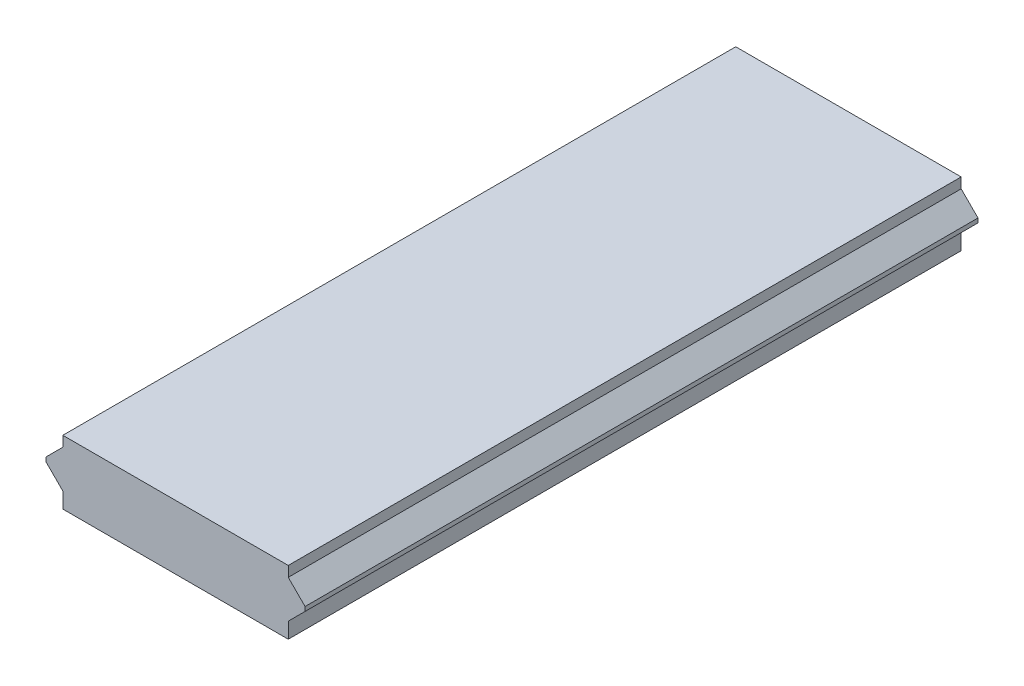
ISO-10303-21;
HEADER;
FILE_DESCRIPTION(('STEP AP214'),'2;1');
FILE_NAME('part.step','',(''),(''),'','','');
FILE_SCHEMA(('AUTOMOTIVE_DESIGN { 1 0 10303 214 1 1 1 1 }'));
ENDSEC;
DATA;
#1=APPLICATION_CONTEXT('core data for automotive mechanical design processes');
#2=APPLICATION_PROTOCOL_DEFINITION('international standard','automotive_design',2000,#1);
#3=PRODUCT_CONTEXT('',#1,'mechanical');
#4=PRODUCT('Part','Part','',(#3));
#5=PRODUCT_RELATED_PRODUCT_CATEGORY('part','',(#4));
#6=PRODUCT_DEFINITION_FORMATION('','',#4);
#7=PRODUCT_DEFINITION_CONTEXT('part definition',#1,'design');
#8=PRODUCT_DEFINITION('design','',#6,#7);
#9=PRODUCT_DEFINITION_SHAPE('','',#8);
#10=(LENGTH_UNIT() NAMED_UNIT(*) SI_UNIT(.MILLI.,.METRE.));
#11=(NAMED_UNIT(*) PLANE_ANGLE_UNIT() SI_UNIT($,.RADIAN.));
#12=(NAMED_UNIT(*) SI_UNIT($,.STERADIAN.) SOLID_ANGLE_UNIT());
#13=UNCERTAINTY_MEASURE_WITH_UNIT(LENGTH_MEASURE(1.E-05),#10,'distance_accuracy_value','');
#14=(GEOMETRIC_REPRESENTATION_CONTEXT(3) GLOBAL_UNCERTAINTY_ASSIGNED_CONTEXT((#13)) GLOBAL_UNIT_ASSIGNED_CONTEXT((#10,
#11,#12)) REPRESENTATION_CONTEXT('',''));
#15=CARTESIAN_POINT('',(0.,0.,0.));
#16=DIRECTION('',(0.,0.,1.));
#17=DIRECTION('',(1.,0.,0.));
#18=AXIS2_PLACEMENT_3D('',#15,#16,#17);
#19=CARTESIAN_POINT('',(-73.,30.7790066638099,-200.));
#20=DIRECTION('',(-1.,0.,0.));
#21=DIRECTION('',(0.,0.,1.));
#22=AXIS2_PLACEMENT_3D('',#19,#20,#21);
#23=PLANE('',#22);
#24=DIRECTION('',(0.,-1.,0.));
#25=VECTOR('',#24,1.);
#26=CARTESIAN_POINT('',(-73.,30.7790066638099,0.));
#27=LINE('',#26,#25);
#28=CARTESIAN_POINT('',(-73.,35.4358609133023,0.));
#29=VERTEX_POINT('',#28);
#30=CARTESIAN_POINT('',(-73.,30.7790066638099,0.));
#31=VERTEX_POINT('',#30);
#32=EDGE_CURVE('E156',#29,#31,#27,.T.);
#33=ORIENTED_EDGE('',*,*,#32,.F.);
#34=DIRECTION('',(0.,0.,1.));
#35=VECTOR('',#34,1.);
#36=CARTESIAN_POINT('',(-73.,35.4358609133023,-200.));
#37=LINE('',#36,#35);
#38=CARTESIAN_POINT('',(-73.,35.4358609133023,-200.));
#39=VERTEX_POINT('',#38);
#40=EDGE_CURVE('E11',#39,#29,#37,.T.);
#41=ORIENTED_EDGE('',*,*,#40,.F.);
#42=DIRECTION('',(0.,-1.,0.));
#43=VECTOR('',#42,1.);
#44=CARTESIAN_POINT('',(-73.,30.7790066638099,-200.));
#45=LINE('',#44,#43);
#46=CARTESIAN_POINT('',(-73.,30.7790066638099,-200.));
#47=VERTEX_POINT('',#46);
#48=EDGE_CURVE('E188',#39,#47,#45,.T.);
#49=ORIENTED_EDGE('',*,*,#48,.T.);
#50=DIRECTION('',(0.,0.,1.));
#51=VECTOR('',#50,1.);
#52=CARTESIAN_POINT('',(-73.,30.7790066638099,-200.));
#53=LINE('',#52,#51);
#54=EDGE_CURVE('E38',#47,#31,#53,.T.);
#55=ORIENTED_EDGE('',*,*,#54,.T.);
#56=EDGE_LOOP('',(#33,#41,#49,#55));
#57=FACE_BOUND('',#56,.T.);
#58=ADVANCED_FACE('F35',(#57),#23,.T.);
#59=CARTESIAN_POINT('',(-73.,35.4358609133023,-200.));
#60=DIRECTION('',(-0.707106781186547,-0.707106781186547,0.));
#61=DIRECTION('',(0.707106781186548,-0.707106781186548,0.));
#62=AXIS2_PLACEMENT_3D('',#59,#60,#61);
#63=PLANE('',#62);
#64=DIRECTION('',(0.707106781186547,-0.707106781186547,0.));
#65=VECTOR('',#64,1.);
#66=CARTESIAN_POINT('',(-73.,35.4358609133023,0.));
#67=LINE('',#66,#65);
#68=CARTESIAN_POINT('',(-78.,40.4358609133023,0.));
#69=VERTEX_POINT('',#68);
#70=EDGE_CURVE('E186',#69,#29,#67,.T.);
#71=ORIENTED_EDGE('',*,*,#70,.F.);
#72=DIRECTION('',(0.,0.,1.));
#73=VECTOR('',#72,1.);
#74=CARTESIAN_POINT('',(-78.,40.4358609133023,-200.));
#75=LINE('',#74,#73);
#76=CARTESIAN_POINT('',(-78.,40.4358609133023,-200.));
#77=VERTEX_POINT('',#76);
#78=EDGE_CURVE('E44',#77,#69,#75,.T.);
#79=ORIENTED_EDGE('',*,*,#78,.F.);
#80=DIRECTION('',(0.707106781186547,-0.707106781186547,0.));
#81=VECTOR('',#80,1.);
#82=CARTESIAN_POINT('',(-73.,35.4358609133023,-200.));
#83=LINE('',#82,#81);
#84=EDGE_CURVE('E146',#77,#39,#83,.T.);
#85=ORIENTED_EDGE('',*,*,#84,.T.);
#86=ORIENTED_EDGE('',*,*,#40,.T.);
#87=EDGE_LOOP('',(#71,#79,#85,#86));
#88=FACE_BOUND('',#87,.T.);
#89=ADVANCED_FACE('F208',(#88),#63,.T.);
#90=CARTESIAN_POINT('',(-78.,40.4358609133023,-200.));
#91=DIRECTION('',(-1.,0.,0.));
#92=DIRECTION('',(0.,0.,1.));
#93=AXIS2_PLACEMENT_3D('',#90,#91,#92);
#94=PLANE('',#93);
#95=DIRECTION('',(0.,-1.,0.));
#96=VECTOR('',#95,1.);
#97=CARTESIAN_POINT('',(-78.,40.4358609133023,0.));
#98=LINE('',#97,#96);
#99=CARTESIAN_POINT('',(-78.,41.7079388519444,0.));
#100=VERTEX_POINT('',#99);
#101=EDGE_CURVE('E133',#100,#69,#98,.T.);
#102=ORIENTED_EDGE('',*,*,#101,.F.);
#103=DIRECTION('',(0.,0.,1.));
#104=VECTOR('',#103,1.);
#105=CARTESIAN_POINT('',(-78.,41.7079388519444,-200.));
#106=LINE('',#105,#104);
#107=CARTESIAN_POINT('',(-78.,41.7079388519444,-200.));
#108=VERTEX_POINT('',#107);
#109=EDGE_CURVE('E128',#108,#100,#106,.T.);
#110=ORIENTED_EDGE('',*,*,#109,.F.);
#111=DIRECTION('',(0.,-1.,0.));
#112=VECTOR('',#111,1.);
#113=CARTESIAN_POINT('',(-78.,40.4358609133023,-200.));
#114=LINE('',#113,#112);
#115=EDGE_CURVE('E131',#108,#77,#114,.T.);
#116=ORIENTED_EDGE('',*,*,#115,.T.);
#117=ORIENTED_EDGE('',*,*,#78,.T.);
#118=EDGE_LOOP('',(#102,#110,#116,#117));
#119=FACE_BOUND('',#118,.T.);
#120=ADVANCED_FACE('F130',(#119),#94,.T.);
#121=CARTESIAN_POINT('',(-78.,41.7079388519444,-200.));
#122=DIRECTION('',(-0.707106781186548,0.707106781186547,0.));
#123=DIRECTION('',(-0.707106781186547,-0.707106781186548,0.));
#124=AXIS2_PLACEMENT_3D('',#121,#122,#123);
#125=PLANE('',#124);
#126=DIRECTION('',(-0.707106781186547,-0.707106781186548,0.));
#127=VECTOR('',#126,1.);
#128=CARTESIAN_POINT('',(-78.,41.7079388519444,0.));
#129=LINE('',#128,#127);
#130=CARTESIAN_POINT('',(-73.,46.7079388519444,0.));
#131=VERTEX_POINT('',#130);
#132=EDGE_CURVE('E183',#131,#100,#129,.T.);
#133=ORIENTED_EDGE('',*,*,#132,.F.);
#134=DIRECTION('',(0.,0.,1.));
#135=VECTOR('',#134,1.);
#136=CARTESIAN_POINT('',(-73.,46.7079388519444,-200.));
#137=LINE('',#136,#135);
#138=CARTESIAN_POINT('',(-73.,46.7079388519444,-200.));
#139=VERTEX_POINT('',#138);
#140=EDGE_CURVE('E138',#139,#131,#137,.T.);
#141=ORIENTED_EDGE('',*,*,#140,.F.);
#142=DIRECTION('',(-0.707106781186547,-0.707106781186548,0.));
#143=VECTOR('',#142,1.);
#144=CARTESIAN_POINT('',(-78.,41.7079388519444,-200.));
#145=LINE('',#144,#143);
#146=EDGE_CURVE('E144',#139,#108,#145,.T.);
#147=ORIENTED_EDGE('',*,*,#146,.T.);
#148=ORIENTED_EDGE('',*,*,#109,.T.);
#149=EDGE_LOOP('',(#133,#141,#147,#148));
#150=FACE_BOUND('',#149,.T.);
#151=ADVANCED_FACE('F148',(#150),#125,.T.);
#152=CARTESIAN_POINT('',(-73.,46.7079388519444,-200.));
#153=DIRECTION('',(-1.,0.,0.));
#154=DIRECTION('',(0.,0.,1.));
#155=AXIS2_PLACEMENT_3D('',#152,#153,#154);
#156=PLANE('',#155);
#157=DIRECTION('',(0.,-1.,0.));
#158=VECTOR('',#157,1.);
#159=CARTESIAN_POINT('',(-73.,46.7079388519444,0.));
#160=LINE('',#159,#158);
#161=CARTESIAN_POINT('',(-73.,49.7790066638099,0.));
#162=VERTEX_POINT('',#161);
#163=EDGE_CURVE('E180',#162,#131,#160,.T.);
#164=ORIENTED_EDGE('',*,*,#163,.F.);
#165=DIRECTION('',(0.,0.,1.));
#166=VECTOR('',#165,1.);
#167=CARTESIAN_POINT('',(-73.,49.7790066638099,-200.));
#168=LINE('',#167,#166);
#169=CARTESIAN_POINT('',(-73.,49.7790066638099,-200.));
#170=VERTEX_POINT('',#169);
#171=EDGE_CURVE('E192',#170,#162,#168,.T.);
#172=ORIENTED_EDGE('',*,*,#171,.F.);
#173=DIRECTION('',(0.,-1.,0.));
#174=VECTOR('',#173,1.);
#175=CARTESIAN_POINT('',(-73.,46.7079388519444,-200.));
#176=LINE('',#175,#174);
#177=EDGE_CURVE('E149',#170,#139,#176,.T.);
#178=ORIENTED_EDGE('',*,*,#177,.T.);
#179=ORIENTED_EDGE('',*,*,#140,.T.);
#180=EDGE_LOOP('',(#164,#172,#178,#179));
#181=FACE_BOUND('',#180,.T.);
#182=ADVANCED_FACE('F221',(#181),#156,.T.);
#183=CARTESIAN_POINT('',(-73.,49.7790066638099,-200.));
#184=DIRECTION('',(0.,1.,0.));
#185=DIRECTION('',(0.,0.,1.));
#186=AXIS2_PLACEMENT_3D('',#183,#184,#185);
#187=PLANE('',#186);
#188=DIRECTION('',(-1.,0.,0.));
#189=VECTOR('',#188,1.);
#190=CARTESIAN_POINT('',(-73.,49.7790066638099,0.));
#191=LINE('',#190,#189);
#192=CARTESIAN_POINT('',(-5.99999999999999,49.7790066638099,0.));
#193=VERTEX_POINT('',#192);
#194=EDGE_CURVE('E177',#193,#162,#191,.T.);
#195=ORIENTED_EDGE('',*,*,#194,.F.);
#196=DIRECTION('',(0.,0.,1.));
#197=VECTOR('',#196,1.);
#198=CARTESIAN_POINT('',(-5.99999999999999,49.7790066638099,-200.));
#199=LINE('',#198,#197);
#200=CARTESIAN_POINT('',(-5.99999999999999,49.7790066638099,-200.));
#201=VERTEX_POINT('',#200);
#202=EDGE_CURVE('E194',#201,#193,#199,.T.);
#203=ORIENTED_EDGE('',*,*,#202,.F.);
#204=DIRECTION('',(-1.,0.,0.));
#205=VECTOR('',#204,1.);
#206=CARTESIAN_POINT('',(-73.,49.7790066638099,-200.));
#207=LINE('',#206,#205);
#208=EDGE_CURVE('E151',#201,#170,#207,.T.);
#209=ORIENTED_EDGE('',*,*,#208,.T.);
#210=ORIENTED_EDGE('',*,*,#171,.T.);
#211=EDGE_LOOP('',(#195,#203,#209,#210));
#212=FACE_BOUND('',#211,.T.);
#213=ADVANCED_FACE('F224',(#212),#187,.T.);
#214=CARTESIAN_POINT('',(-5.99999999999999,46.7079388519444,-200.));
#215=DIRECTION('',(1.,0.,0.));
#216=DIRECTION('',(0.,0.,-1.));
#217=AXIS2_PLACEMENT_3D('',#214,#215,#216);
#218=PLANE('',#217);
#219=DIRECTION('',(0.,1.,0.));
#220=VECTOR('',#219,1.);
#221=CARTESIAN_POINT('',(-5.99999999999999,46.7079388519444,0.));
#222=LINE('',#221,#220);
#223=CARTESIAN_POINT('',(-5.99999999999999,46.7079388519444,0.));
#224=VERTEX_POINT('',#223);
#225=EDGE_CURVE('E174',#224,#193,#222,.T.);
#226=ORIENTED_EDGE('',*,*,#225,.F.);
#227=DIRECTION('',(0.,0.,1.));
#228=VECTOR('',#227,1.);
#229=CARTESIAN_POINT('',(-5.99999999999999,46.7079388519444,-200.));
#230=LINE('',#229,#228);
#231=CARTESIAN_POINT('',(-5.99999999999999,46.7079388519444,-200.));
#232=VERTEX_POINT('',#231);
#233=EDGE_CURVE('E196',#232,#224,#230,.T.);
#234=ORIENTED_EDGE('',*,*,#233,.F.);
#235=DIRECTION('',(0.,1.,0.));
#236=VECTOR('',#235,1.);
#237=CARTESIAN_POINT('',(-5.99999999999999,46.7079388519444,-200.));
#238=LINE('',#237,#236);
#239=EDGE_CURVE('E350',#232,#201,#238,.T.);
#240=ORIENTED_EDGE('',*,*,#239,.T.);
#241=ORIENTED_EDGE('',*,*,#202,.T.);
#242=EDGE_LOOP('',(#226,#234,#240,#241));
#243=FACE_BOUND('',#242,.T.);
#244=ADVANCED_FACE('F228',(#243),#218,.T.);
#245=CARTESIAN_POINT('',(-0.999999999999987,41.7079388519444,-200.));
#246=DIRECTION('',(0.707106781186547,0.707106781186547,0.));
#247=DIRECTION('',(-0.707106781186548,0.707106781186548,0.));
#248=AXIS2_PLACEMENT_3D('',#245,#246,#247);
#249=PLANE('',#248);
#250=DIRECTION('',(-0.707106781186547,0.707106781186547,0.));
#251=VECTOR('',#250,1.);
#252=CARTESIAN_POINT('',(-0.999999999999987,41.7079388519444,0.));
#253=LINE('',#252,#251);
#254=CARTESIAN_POINT('',(-0.999999999999987,41.7079388519444,0.));
#255=VERTEX_POINT('',#254);
#256=EDGE_CURVE('E171',#255,#224,#253,.T.);
#257=ORIENTED_EDGE('',*,*,#256,.F.);
#258=DIRECTION('',(0.,0.,1.));
#259=VECTOR('',#258,1.);
#260=CARTESIAN_POINT('',(-0.999999999999987,41.7079388519444,-200.));
#261=LINE('',#260,#259);
#262=CARTESIAN_POINT('',(-0.999999999999987,41.7079388519444,-200.));
#263=VERTEX_POINT('',#262);
#264=EDGE_CURVE('E198',#263,#255,#261,.T.);
#265=ORIENTED_EDGE('',*,*,#264,.F.);
#266=DIRECTION('',(-0.707106781186547,0.707106781186547,0.));
#267=VECTOR('',#266,1.);
#268=CARTESIAN_POINT('',(-0.999999999999987,41.7079388519444,-200.));
#269=LINE('',#268,#267);
#270=EDGE_CURVE('E354',#263,#232,#269,.T.);
#271=ORIENTED_EDGE('',*,*,#270,.T.);
#272=ORIENTED_EDGE('',*,*,#233,.T.);
#273=EDGE_LOOP('',(#257,#265,#271,#272));
#274=FACE_BOUND('',#273,.T.);
#275=ADVANCED_FACE('F232',(#274),#249,.T.);
#276=CARTESIAN_POINT('',(-0.999999999999987,40.4358609133023,-200.));
#277=DIRECTION('',(1.,0.,0.));
#278=DIRECTION('',(0.,0.,-1.));
#279=AXIS2_PLACEMENT_3D('',#276,#277,#278);
#280=PLANE('',#279);
#281=DIRECTION('',(0.,1.,0.));
#282=VECTOR('',#281,1.);
#283=CARTESIAN_POINT('',(-0.999999999999987,40.4358609133023,0.));
#284=LINE('',#283,#282);
#285=CARTESIAN_POINT('',(-0.999999999999987,40.4358609133023,0.));
#286=VERTEX_POINT('',#285);
#287=EDGE_CURVE('E168',#286,#255,#284,.T.);
#288=ORIENTED_EDGE('',*,*,#287,.F.);
#289=DIRECTION('',(0.,0.,1.));
#290=VECTOR('',#289,1.);
#291=CARTESIAN_POINT('',(-0.999999999999987,40.4358609133023,-200.));
#292=LINE('',#291,#290);
#293=CARTESIAN_POINT('',(-0.999999999999987,40.4358609133023,-200.));
#294=VERTEX_POINT('',#293);
#295=EDGE_CURVE('E200',#294,#286,#292,.T.);
#296=ORIENTED_EDGE('',*,*,#295,.F.);
#297=DIRECTION('',(0.,1.,0.));
#298=VECTOR('',#297,1.);
#299=CARTESIAN_POINT('',(-0.999999999999987,40.4358609133023,-200.));
#300=LINE('',#299,#298);
#301=EDGE_CURVE('E343',#294,#263,#300,.T.);
#302=ORIENTED_EDGE('',*,*,#301,.T.);
#303=ORIENTED_EDGE('',*,*,#264,.T.);
#304=EDGE_LOOP('',(#288,#296,#302,#303));
#305=FACE_BOUND('',#304,.T.);
#306=ADVANCED_FACE('F236',(#305),#280,.T.);
#307=CARTESIAN_POINT('',(-5.99999999999999,35.4358609133023,-200.));
#308=DIRECTION('',(0.707106781186549,-0.707106781186546,0.));
#309=DIRECTION('',(0.707106781186546,0.707106781186549,0.));
#310=AXIS2_PLACEMENT_3D('',#307,#308,#309);
#311=PLANE('',#310);
#312=DIRECTION('',(0.707106781186546,0.707106781186549,0.));
#313=VECTOR('',#312,1.);
#314=CARTESIAN_POINT('',(-5.99999999999999,35.4358609133023,0.));
#315=LINE('',#314,#313);
#316=CARTESIAN_POINT('',(-5.99999999999999,35.4358609133023,0.));
#317=VERTEX_POINT('',#316);
#318=EDGE_CURVE('E165',#317,#286,#315,.T.);
#319=ORIENTED_EDGE('',*,*,#318,.F.);
#320=DIRECTION('',(0.,0.,1.));
#321=VECTOR('',#320,1.);
#322=CARTESIAN_POINT('',(-5.99999999999999,35.4358609133023,-200.));
#323=LINE('',#322,#321);
#324=CARTESIAN_POINT('',(-5.99999999999999,35.4358609133023,-200.));
#325=VERTEX_POINT('',#324);
#326=EDGE_CURVE('E202',#325,#317,#323,.T.);
#327=ORIENTED_EDGE('',*,*,#326,.F.);
#328=DIRECTION('',(0.707106781186546,0.707106781186549,0.));
#329=VECTOR('',#328,1.);
#330=CARTESIAN_POINT('',(-5.99999999999999,35.4358609133023,-200.));
#331=LINE('',#330,#329);
#332=EDGE_CURVE('E339',#325,#294,#331,.T.);
#333=ORIENTED_EDGE('',*,*,#332,.T.);
#334=ORIENTED_EDGE('',*,*,#295,.T.);
#335=EDGE_LOOP('',(#319,#327,#333,#334));
#336=FACE_BOUND('',#335,.T.);
#337=ADVANCED_FACE('F240',(#336),#311,.T.);
#338=CARTESIAN_POINT('',(-5.99999999999999,30.7790066638099,-200.));
#339=DIRECTION('',(1.,0.,0.));
#340=DIRECTION('',(0.,0.,-1.));
#341=AXIS2_PLACEMENT_3D('',#338,#339,#340);
#342=PLANE('',#341);
#343=DIRECTION('',(0.,1.,0.));
#344=VECTOR('',#343,1.);
#345=CARTESIAN_POINT('',(-5.99999999999999,30.7790066638099,0.));
#346=LINE('',#345,#344);
#347=CARTESIAN_POINT('',(-5.99999999999999,30.7790066638099,0.));
#348=VERTEX_POINT('',#347);
#349=EDGE_CURVE('E162',#348,#317,#346,.T.);
#350=ORIENTED_EDGE('',*,*,#349,.F.);
#351=DIRECTION('',(0.,0.,1.));
#352=VECTOR('',#351,1.);
#353=CARTESIAN_POINT('',(-5.99999999999999,30.7790066638099,-200.));
#354=LINE('',#353,#352);
#355=CARTESIAN_POINT('',(-5.99999999999999,30.7790066638099,-200.));
#356=VERTEX_POINT('',#355);
#357=EDGE_CURVE('E203',#356,#348,#354,.T.);
#358=ORIENTED_EDGE('',*,*,#357,.F.);
#359=DIRECTION('',(0.,1.,0.));
#360=VECTOR('',#359,1.);
#361=CARTESIAN_POINT('',(-5.99999999999999,30.7790066638099,-200.));
#362=LINE('',#361,#360);
#363=EDGE_CURVE('E360',#356,#325,#362,.T.);
#364=ORIENTED_EDGE('',*,*,#363,.T.);
#365=ORIENTED_EDGE('',*,*,#326,.T.);
#366=EDGE_LOOP('',(#350,#358,#364,#365));
#367=FACE_BOUND('',#366,.T.);
#368=ADVANCED_FACE('F244',(#367),#342,.T.);
#369=CARTESIAN_POINT('',(-5.99999999999999,30.7790066638099,-200.));
#370=DIRECTION('',(0.,-1.,0.));
#371=DIRECTION('',(1.,0.,0.));
#372=AXIS2_PLACEMENT_3D('',#369,#370,#371);
#373=PLANE('',#372);
#374=DIRECTION('',(1.,0.,0.));
#375=VECTOR('',#374,1.);
#376=CARTESIAN_POINT('',(-5.99999999999999,30.7790066638099,0.));
#377=LINE('',#376,#375);
#378=EDGE_CURVE('E159',#31,#348,#377,.T.);
#379=ORIENTED_EDGE('',*,*,#378,.F.);
#380=ORIENTED_EDGE('',*,*,#54,.F.);
#381=DIRECTION('',(1.,0.,0.));
#382=VECTOR('',#381,1.);
#383=CARTESIAN_POINT('',(-5.99999999999999,30.7790066638099,-200.));
#384=LINE('',#383,#382);
#385=EDGE_CURVE('E362',#47,#356,#384,.T.);
#386=ORIENTED_EDGE('',*,*,#385,.T.);
#387=ORIENTED_EDGE('',*,*,#357,.T.);
#388=EDGE_LOOP('',(#379,#380,#386,#387));
#389=FACE_BOUND('',#388,.T.);
#390=ADVANCED_FACE('F205',(#389),#373,.T.);
#391=CARTESIAN_POINT('',(0.,0.,-200.));
#392=DIRECTION('',(0.,0.,-1.));
#393=DIRECTION('',(-1.,0.,0.));
#394=AXIS2_PLACEMENT_3D('',#391,#392,#393);
#395=PLANE('',#394);
#396=ORIENTED_EDGE('',*,*,#48,.F.);
#397=ORIENTED_EDGE('',*,*,#84,.F.);
#398=ORIENTED_EDGE('',*,*,#115,.F.);
#399=ORIENTED_EDGE('',*,*,#146,.F.);
#400=ORIENTED_EDGE('',*,*,#177,.F.);
#401=ORIENTED_EDGE('',*,*,#208,.F.);
#402=ORIENTED_EDGE('',*,*,#239,.F.);
#403=ORIENTED_EDGE('',*,*,#270,.F.);
#404=ORIENTED_EDGE('',*,*,#301,.F.);
#405=ORIENTED_EDGE('',*,*,#332,.F.);
#406=ORIENTED_EDGE('',*,*,#363,.F.);
#407=ORIENTED_EDGE('',*,*,#385,.F.);
#408=EDGE_LOOP('',(#396,#397,#398,#399,#400,#401,#402,#403,#404,#405,#406,#407));
#409=FACE_BOUND('',#408,.T.);
#410=ADVANCED_FACE('F142',(#409),#395,.T.);
#411=CARTESIAN_POINT('',(0.,0.,0.));
#412=DIRECTION('',(0.,0.,-1.));
#413=DIRECTION('',(-1.,0.,0.));
#414=AXIS2_PLACEMENT_3D('',#411,#412,#413);
#415=PLANE('',#414);
#416=ORIENTED_EDGE('',*,*,#32,.T.);
#417=ORIENTED_EDGE('',*,*,#378,.T.);
#418=ORIENTED_EDGE('',*,*,#349,.T.);
#419=ORIENTED_EDGE('',*,*,#318,.T.);
#420=ORIENTED_EDGE('',*,*,#287,.T.);
#421=ORIENTED_EDGE('',*,*,#256,.T.);
#422=ORIENTED_EDGE('',*,*,#225,.T.);
#423=ORIENTED_EDGE('',*,*,#194,.T.);
#424=ORIENTED_EDGE('',*,*,#163,.T.);
#425=ORIENTED_EDGE('',*,*,#132,.T.);
#426=ORIENTED_EDGE('',*,*,#101,.T.);
#427=ORIENTED_EDGE('',*,*,#70,.T.);
#428=EDGE_LOOP('',(#416,#417,#418,#419,#420,#421,#422,#423,#424,#425,#426,#427));
#429=FACE_BOUND('',#428,.T.);
#430=ADVANCED_FACE('F207',(#429),#415,.F.);
#431=CLOSED_SHELL('',(#58,#89,#120,#151,#182,#213,#244,#275,#306,#337,#368,#390,#410,#430));
#432=MANIFOLD_SOLID_BREP('B2',#431);
#433=ADVANCED_BREP_SHAPE_REPRESENTATION('',(#18,#432),#14);
#434=SHAPE_DEFINITION_REPRESENTATION(#9,#433);
ENDSEC;
END-ISO-10303-21;
